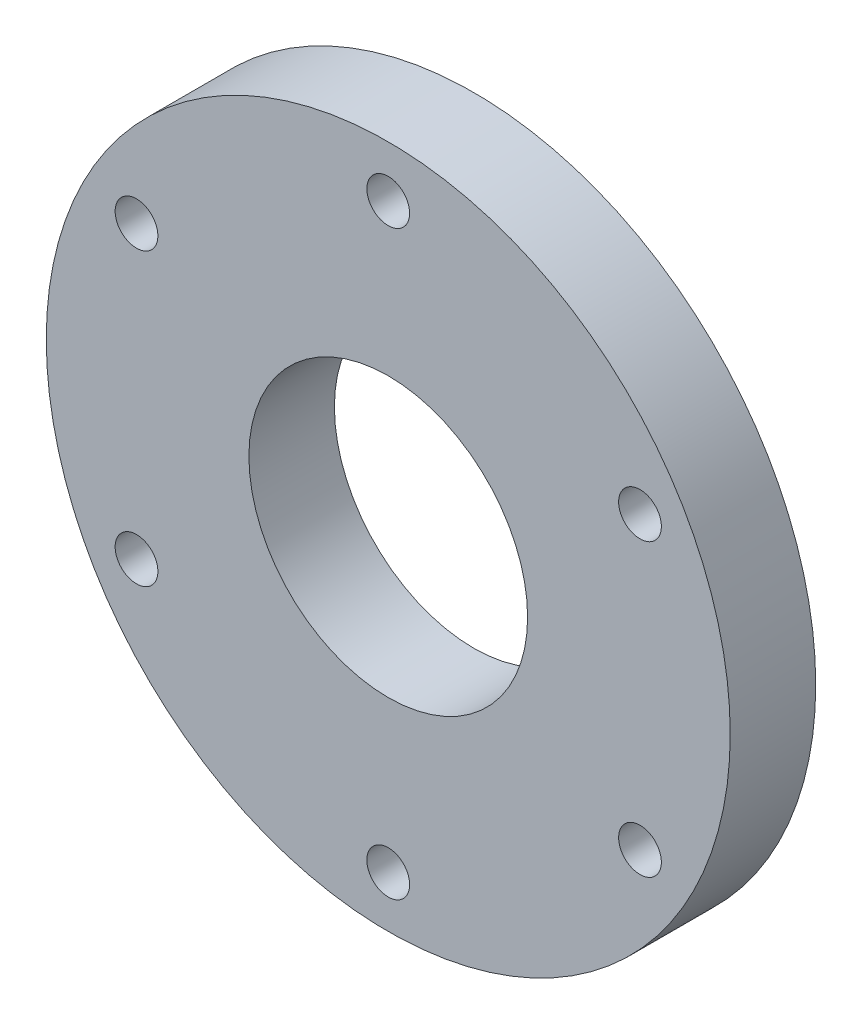
ISO-10303-21;
HEADER;
FILE_DESCRIPTION(('STEP AP214'),'2;1');
FILE_NAME('part.step','',(''),(''),'','','');
FILE_SCHEMA(('AUTOMOTIVE_DESIGN { 1 0 10303 214 1 1 1 1 }'));
ENDSEC;
DATA;
#1=APPLICATION_CONTEXT('core data for automotive mechanical design processes');
#2=APPLICATION_PROTOCOL_DEFINITION('international standard','automotive_design',2000,#1);
#3=PRODUCT_CONTEXT('',#1,'mechanical');
#4=PRODUCT('Part','Part','',(#3));
#5=PRODUCT_RELATED_PRODUCT_CATEGORY('part','',(#4));
#6=PRODUCT_DEFINITION_FORMATION('','',#4);
#7=PRODUCT_DEFINITION_CONTEXT('part definition',#1,'design');
#8=PRODUCT_DEFINITION('design','',#6,#7);
#9=PRODUCT_DEFINITION_SHAPE('','',#8);
#10=(LENGTH_UNIT() NAMED_UNIT(*) SI_UNIT(.MILLI.,.METRE.));
#11=(NAMED_UNIT(*) PLANE_ANGLE_UNIT() SI_UNIT($,.RADIAN.));
#12=(NAMED_UNIT(*) SI_UNIT($,.STERADIAN.) SOLID_ANGLE_UNIT());
#13=UNCERTAINTY_MEASURE_WITH_UNIT(LENGTH_MEASURE(1.E-05),#10,'distance_accuracy_value','');
#14=(GEOMETRIC_REPRESENTATION_CONTEXT(3) GLOBAL_UNCERTAINTY_ASSIGNED_CONTEXT((#13)) GLOBAL_UNIT_ASSIGNED_CONTEXT((#10,
#11,#12)) REPRESENTATION_CONTEXT('',''));
#15=CARTESIAN_POINT('',(0.,0.,0.));
#16=DIRECTION('',(0.,0.,1.));
#17=DIRECTION('',(1.,0.,0.));
#18=AXIS2_PLACEMENT_3D('',#15,#16,#17);
#19=CARTESIAN_POINT('',(0.,0.,5.));
#20=DIRECTION('',(0.,0.,1.));
#21=DIRECTION('',(1.,0.,0.));
#22=AXIS2_PLACEMENT_3D('',#19,#20,#21);
#23=PLANE('',#22);
#24=CARTESIAN_POINT('',(-14.7224318643344,-8.50000000000063,5.));
#25=DIRECTION('',(0.,0.,1.));
#26=DIRECTION('',(1.,0.,0.));
#27=AXIS2_PLACEMENT_3D('',#24,#25,#26);
#28=CIRCLE('',#27,1.25000000000138);
#29=CARTESIAN_POINT('',(-13.472431864333,-8.50000000000063,5.));
#30=VERTEX_POINT('',#29);
#31=EDGE_CURVE('E91',#30,#30,#28,.T.);
#32=ORIENTED_EDGE('',*,*,#31,.F.);
#33=EDGE_LOOP('',(#32));
#34=FACE_BOUND('',#33,.T.);
#35=CARTESIAN_POINT('',(14.7224318643365,-8.49999999999937,5.));
#36=DIRECTION('',(0.,0.,1.));
#37=DIRECTION('',(1.,0.,0.));
#38=AXIS2_PLACEMENT_3D('',#35,#36,#37);
#39=CIRCLE('',#38,1.25000000000093);
#40=CARTESIAN_POINT('',(15.9724318643375,-8.49999999999937,5.));
#41=VERTEX_POINT('',#40);
#42=EDGE_CURVE('E74',#41,#41,#39,.T.);
#43=ORIENTED_EDGE('',*,*,#42,.F.);
#44=EDGE_LOOP('',(#43));
#45=FACE_BOUND('',#44,.T.);
#46=CARTESIAN_POINT('',(0.,0.,5.));
#47=DIRECTION('',(0.,0.,1.));
#48=DIRECTION('',(1.,0.,0.));
#49=AXIS2_PLACEMENT_3D('',#46,#47,#48);
#50=CIRCLE('',#49,8.15);
#51=CARTESIAN_POINT('',(8.15,0.,5.));
#52=VERTEX_POINT('',#51);
#53=EDGE_CURVE('E54',#52,#52,#50,.T.);
#54=ORIENTED_EDGE('',*,*,#53,.F.);
#55=EDGE_LOOP('',(#54));
#56=FACE_BOUND('',#55,.T.);
#57=CARTESIAN_POINT('',(0.,0.,5.));
#58=DIRECTION('',(0.,0.,1.));
#59=DIRECTION('',(1.,0.,0.));
#60=AXIS2_PLACEMENT_3D('',#57,#58,#59);
#61=CIRCLE('',#60,20.);
#62=CARTESIAN_POINT('',(20.,0.,5.));
#63=VERTEX_POINT('',#62);
#64=EDGE_CURVE('E11',#63,#63,#61,.T.);
#65=ORIENTED_EDGE('',*,*,#64,.T.);
#66=EDGE_LOOP('',(#65));
#67=FACE_BOUND('',#66,.T.);
#68=CARTESIAN_POINT('',(0.,17.,5.));
#69=DIRECTION('',(0.,0.,1.));
#70=DIRECTION('',(1.,0.,0.));
#71=AXIS2_PLACEMENT_3D('',#68,#69,#70);
#72=CIRCLE('',#71,1.25);
#73=CARTESIAN_POINT('',(1.25,17.,5.));
#74=VERTEX_POINT('',#73);
#75=EDGE_CURVE('E47',#74,#74,#72,.T.);
#76=ORIENTED_EDGE('',*,*,#75,.F.);
#77=EDGE_LOOP('',(#76));
#78=FACE_BOUND('',#77,.T.);
#79=CARTESIAN_POINT('',(14.7224318643358,8.50000000000063,5.));
#80=DIRECTION('',(0.,0.,1.));
#81=DIRECTION('',(1.,0.,0.));
#82=AXIS2_PLACEMENT_3D('',#79,#80,#81);
#83=CIRCLE('',#82,1.25000000000021);
#84=CARTESIAN_POINT('',(15.972431864336,8.50000000000063,5.));
#85=VERTEX_POINT('',#84);
#86=EDGE_CURVE('E67',#85,#85,#83,.T.);
#87=ORIENTED_EDGE('',*,*,#86,.F.);
#88=EDGE_LOOP('',(#87));
#89=FACE_BOUND('',#88,.T.);
#90=CARTESIAN_POINT('',(1.4453433818335E-12,-17.,5.));
#91=DIRECTION('',(0.,0.,1.));
#92=DIRECTION('',(1.,0.,0.));
#93=AXIS2_PLACEMENT_3D('',#90,#91,#92);
#94=CIRCLE('',#93,1.2500000000015);
#95=CARTESIAN_POINT('',(1.25000000000294,-17.,5.));
#96=VERTEX_POINT('',#95);
#97=EDGE_CURVE('E82',#96,#96,#94,.T.);
#98=ORIENTED_EDGE('',*,*,#97,.F.);
#99=EDGE_LOOP('',(#98));
#100=FACE_BOUND('',#99,.T.);
#101=CARTESIAN_POINT('',(-14.7224318643351,8.49999999999936,5.));
#102=DIRECTION('',(0.,0.,1.));
#103=DIRECTION('',(1.,0.,0.));
#104=AXIS2_PLACEMENT_3D('',#101,#102,#103);
#105=CIRCLE('',#104,1.25000000000073);
#106=CARTESIAN_POINT('',(-13.4724318643344,8.49999999999936,5.));
#107=VERTEX_POINT('',#106);
#108=EDGE_CURVE('E98',#107,#107,#105,.T.);
#109=ORIENTED_EDGE('',*,*,#108,.F.);
#110=EDGE_LOOP('',(#109));
#111=FACE_BOUND('',#110,.T.);
#112=ADVANCED_FACE('F34',(#34,#45,#56,#67,#78,#89,#100,#111),#23,.T.);
#113=CARTESIAN_POINT('',(0.,0.,0.));
#114=DIRECTION('',(0.,0.,1.));
#115=DIRECTION('',(1.,0.,0.));
#116=AXIS2_PLACEMENT_3D('',#113,#114,#115);
#117=PLANE('',#116);
#118=CARTESIAN_POINT('',(0.,0.,0.));
#119=DIRECTION('',(0.,0.,1.));
#120=DIRECTION('',(1.,0.,0.));
#121=AXIS2_PLACEMENT_3D('',#118,#119,#120);
#122=CIRCLE('',#121,20.);
#123=CARTESIAN_POINT('',(20.,0.,0.));
#124=VERTEX_POINT('',#123);
#125=EDGE_CURVE('E38',#124,#124,#122,.T.);
#126=ORIENTED_EDGE('',*,*,#125,.F.);
#127=EDGE_LOOP('',(#126));
#128=FACE_BOUND('',#127,.T.);
#129=CARTESIAN_POINT('',(0.,17.,0.));
#130=DIRECTION('',(0.,0.,1.));
#131=DIRECTION('',(1.,0.,0.));
#132=AXIS2_PLACEMENT_3D('',#129,#130,#131);
#133=CIRCLE('',#132,1.25);
#134=CARTESIAN_POINT('',(1.25,17.,0.));
#135=VERTEX_POINT('',#134);
#136=EDGE_CURVE('E49',#135,#135,#133,.T.);
#137=ORIENTED_EDGE('',*,*,#136,.T.);
#138=EDGE_LOOP('',(#137));
#139=FACE_BOUND('',#138,.T.);
#140=CARTESIAN_POINT('',(0.,0.,0.));
#141=DIRECTION('',(0.,0.,1.));
#142=DIRECTION('',(1.,0.,0.));
#143=AXIS2_PLACEMENT_3D('',#140,#141,#142);
#144=CIRCLE('',#143,8.15);
#145=CARTESIAN_POINT('',(8.15,0.,0.));
#146=VERTEX_POINT('',#145);
#147=EDGE_CURVE('E62',#146,#146,#144,.T.);
#148=ORIENTED_EDGE('',*,*,#147,.T.);
#149=EDGE_LOOP('',(#148));
#150=FACE_BOUND('',#149,.T.);
#151=CARTESIAN_POINT('',(14.7224318643358,8.50000000000063,0.));
#152=DIRECTION('',(0.,0.,1.));
#153=DIRECTION('',(1.,0.,0.));
#154=AXIS2_PLACEMENT_3D('',#151,#152,#153);
#155=CIRCLE('',#154,1.25000000000021);
#156=CARTESIAN_POINT('',(15.972431864336,8.50000000000063,0.));
#157=VERTEX_POINT('',#156);
#158=EDGE_CURVE('E69',#157,#157,#155,.T.);
#159=ORIENTED_EDGE('',*,*,#158,.T.);
#160=EDGE_LOOP('',(#159));
#161=FACE_BOUND('',#160,.T.);
#162=CARTESIAN_POINT('',(14.7224318643365,-8.49999999999937,0.));
#163=DIRECTION('',(0.,0.,1.));
#164=DIRECTION('',(1.,0.,0.));
#165=AXIS2_PLACEMENT_3D('',#162,#163,#164);
#166=CIRCLE('',#165,1.25000000000093);
#167=CARTESIAN_POINT('',(15.9724318643375,-8.49999999999937,0.));
#168=VERTEX_POINT('',#167);
#169=EDGE_CURVE('E77',#168,#168,#166,.T.);
#170=ORIENTED_EDGE('',*,*,#169,.T.);
#171=EDGE_LOOP('',(#170));
#172=FACE_BOUND('',#171,.T.);
#173=CARTESIAN_POINT('',(1.4453433818335E-12,-17.,0.));
#174=DIRECTION('',(0.,0.,1.));
#175=DIRECTION('',(1.,0.,0.));
#176=AXIS2_PLACEMENT_3D('',#173,#174,#175);
#177=CIRCLE('',#176,1.2500000000015);
#178=CARTESIAN_POINT('',(1.25000000000294,-17.,0.));
#179=VERTEX_POINT('',#178);
#180=EDGE_CURVE('E86',#179,#179,#177,.T.);
#181=ORIENTED_EDGE('',*,*,#180,.T.);
#182=EDGE_LOOP('',(#181));
#183=FACE_BOUND('',#182,.T.);
#184=CARTESIAN_POINT('',(-14.7224318643344,-8.50000000000063,0.));
#185=DIRECTION('',(0.,0.,1.));
#186=DIRECTION('',(1.,0.,0.));
#187=AXIS2_PLACEMENT_3D('',#184,#185,#186);
#188=CIRCLE('',#187,1.25000000000138);
#189=CARTESIAN_POINT('',(-13.472431864333,-8.50000000000063,0.));
#190=VERTEX_POINT('',#189);
#191=EDGE_CURVE('E93',#190,#190,#188,.T.);
#192=ORIENTED_EDGE('',*,*,#191,.T.);
#193=EDGE_LOOP('',(#192));
#194=FACE_BOUND('',#193,.T.);
#195=CARTESIAN_POINT('',(-14.7224318643351,8.49999999999936,0.));
#196=DIRECTION('',(0.,0.,1.));
#197=DIRECTION('',(1.,0.,0.));
#198=AXIS2_PLACEMENT_3D('',#195,#196,#197);
#199=CIRCLE('',#198,1.25000000000073);
#200=CARTESIAN_POINT('',(-13.4724318643344,8.49999999999936,0.));
#201=VERTEX_POINT('',#200);
#202=EDGE_CURVE('E100',#201,#201,#199,.T.);
#203=ORIENTED_EDGE('',*,*,#202,.T.);
#204=EDGE_LOOP('',(#203));
#205=FACE_BOUND('',#204,.T.);
#206=ADVANCED_FACE('F112',(#128,#139,#150,#161,#172,#183,#194,#205),#117,.F.);
#207=CARTESIAN_POINT('',(0.,0.,5.));
#208=DIRECTION('',(0.,0.,-1.));
#209=DIRECTION('',(-1.,0.,0.));
#210=AXIS2_PLACEMENT_3D('',#207,#208,#209);
#211=CYLINDRICAL_SURFACE('',#210,20.);
#212=ORIENTED_EDGE('',*,*,#64,.F.);
#213=EDGE_LOOP('',(#212));
#214=FACE_BOUND('',#213,.T.);
#215=ORIENTED_EDGE('',*,*,#125,.T.);
#216=EDGE_LOOP('',(#215));
#217=FACE_BOUND('',#216,.T.);
#218=ADVANCED_FACE('F36',(#214,#217),#211,.T.);
#219=CARTESIAN_POINT('',(0.,17.,5.));
#220=DIRECTION('',(0.,0.,-1.));
#221=DIRECTION('',(-1.,0.,0.));
#222=AXIS2_PLACEMENT_3D('',#219,#220,#221);
#223=CYLINDRICAL_SURFACE('',#222,1.25);
#224=ORIENTED_EDGE('',*,*,#75,.T.);
#225=EDGE_LOOP('',(#224));
#226=FACE_BOUND('',#225,.T.);
#227=ORIENTED_EDGE('',*,*,#136,.F.);
#228=EDGE_LOOP('',(#227));
#229=FACE_BOUND('',#228,.T.);
#230=ADVANCED_FACE('F122',(#226,#229),#223,.F.);
#231=CARTESIAN_POINT('',(0.,0.,5.));
#232=DIRECTION('',(0.,0.,-1.));
#233=DIRECTION('',(-1.,0.,0.));
#234=AXIS2_PLACEMENT_3D('',#231,#232,#233);
#235=CYLINDRICAL_SURFACE('',#234,8.15);
#236=ORIENTED_EDGE('',*,*,#53,.T.);
#237=EDGE_LOOP('',(#236));
#238=FACE_BOUND('',#237,.T.);
#239=ORIENTED_EDGE('',*,*,#147,.F.);
#240=EDGE_LOOP('',(#239));
#241=FACE_BOUND('',#240,.T.);
#242=ADVANCED_FACE('F125',(#238,#241),#235,.F.);
#243=CARTESIAN_POINT('',(14.7224318643358,8.50000000000063,5.));
#244=DIRECTION('',(0.,0.,-1.));
#245=DIRECTION('',(-1.,0.,0.));
#246=AXIS2_PLACEMENT_3D('',#243,#244,#245);
#247=CYLINDRICAL_SURFACE('',#246,1.25000000000021);
#248=ORIENTED_EDGE('',*,*,#86,.T.);
#249=EDGE_LOOP('',(#248));
#250=FACE_BOUND('',#249,.T.);
#251=ORIENTED_EDGE('',*,*,#158,.F.);
#252=EDGE_LOOP('',(#251));
#253=FACE_BOUND('',#252,.T.);
#254=ADVANCED_FACE('F129',(#250,#253),#247,.F.);
#255=CARTESIAN_POINT('',(14.7224318643365,-8.49999999999937,5.));
#256=DIRECTION('',(0.,0.,-1.));
#257=DIRECTION('',(-1.,0.,0.));
#258=AXIS2_PLACEMENT_3D('',#255,#256,#257);
#259=CYLINDRICAL_SURFACE('',#258,1.25000000000093);
#260=ORIENTED_EDGE('',*,*,#42,.T.);
#261=EDGE_LOOP('',(#260));
#262=FACE_BOUND('',#261,.T.);
#263=ORIENTED_EDGE('',*,*,#169,.F.);
#264=EDGE_LOOP('',(#263));
#265=FACE_BOUND('',#264,.T.);
#266=ADVANCED_FACE('F133',(#262,#265),#259,.F.);
#267=CARTESIAN_POINT('',(1.4453433818335E-12,-17.,5.));
#268=DIRECTION('',(0.,0.,-1.));
#269=DIRECTION('',(-1.,0.,0.));
#270=AXIS2_PLACEMENT_3D('',#267,#268,#269);
#271=CYLINDRICAL_SURFACE('',#270,1.2500000000015);
#272=ORIENTED_EDGE('',*,*,#97,.T.);
#273=EDGE_LOOP('',(#272));
#274=FACE_BOUND('',#273,.T.);
#275=ORIENTED_EDGE('',*,*,#180,.F.);
#276=EDGE_LOOP('',(#275));
#277=FACE_BOUND('',#276,.T.);
#278=ADVANCED_FACE('F137',(#274,#277),#271,.F.);
#279=CARTESIAN_POINT('',(-14.7224318643344,-8.50000000000063,5.));
#280=DIRECTION('',(0.,0.,-1.));
#281=DIRECTION('',(-1.,0.,0.));
#282=AXIS2_PLACEMENT_3D('',#279,#280,#281);
#283=CYLINDRICAL_SURFACE('',#282,1.25000000000138);
#284=ORIENTED_EDGE('',*,*,#31,.T.);
#285=EDGE_LOOP('',(#284));
#286=FACE_BOUND('',#285,.T.);
#287=ORIENTED_EDGE('',*,*,#191,.F.);
#288=EDGE_LOOP('',(#287));
#289=FACE_BOUND('',#288,.T.);
#290=ADVANCED_FACE('F141',(#286,#289),#283,.F.);
#291=CARTESIAN_POINT('',(-14.7224318643351,8.49999999999936,5.));
#292=DIRECTION('',(0.,0.,-1.));
#293=DIRECTION('',(-1.,0.,0.));
#294=AXIS2_PLACEMENT_3D('',#291,#292,#293);
#295=CYLINDRICAL_SURFACE('',#294,1.25000000000073);
#296=ORIENTED_EDGE('',*,*,#108,.T.);
#297=EDGE_LOOP('',(#296));
#298=FACE_BOUND('',#297,.T.);
#299=ORIENTED_EDGE('',*,*,#202,.F.);
#300=EDGE_LOOP('',(#299));
#301=FACE_BOUND('',#300,.T.);
#302=ADVANCED_FACE('F108',(#298,#301),#295,.F.);
#303=CLOSED_SHELL('',(#112,#206,#218,#230,#242,#254,#266,#278,#290,#302));
#304=MANIFOLD_SOLID_BREP('B2',#303);
#305=ADVANCED_BREP_SHAPE_REPRESENTATION('',(#18,#304),#14);
#306=SHAPE_DEFINITION_REPRESENTATION(#9,#305);
ENDSEC;
END-ISO-10303-21;
